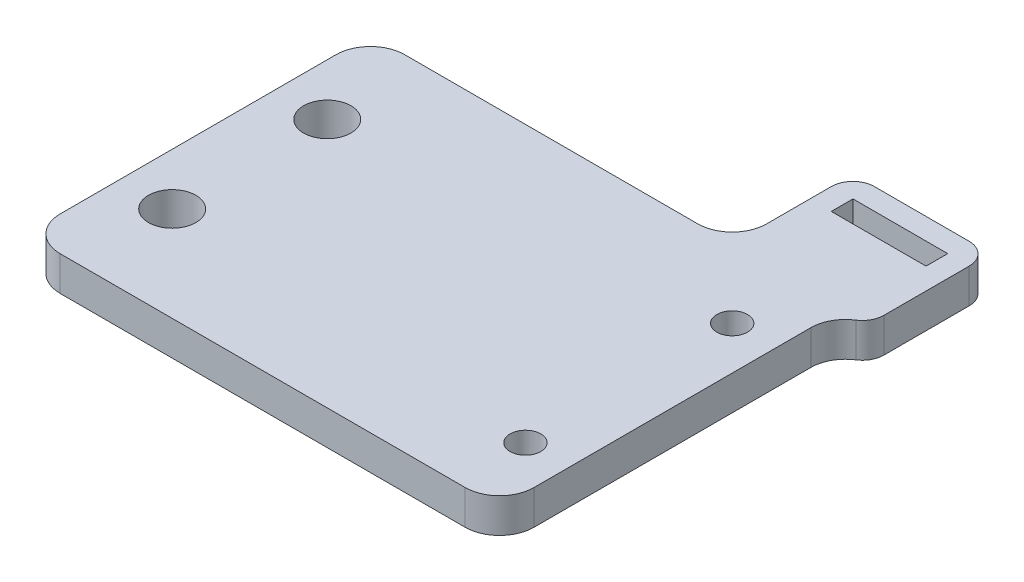
ISO-10303-21;
HEADER;
FILE_DESCRIPTION(('STEP AP214'),'2;1');
FILE_NAME('part.step','',(''),(''),'','','');
FILE_SCHEMA(('AUTOMOTIVE_DESIGN { 1 0 10303 214 1 1 1 1 }'));
ENDSEC;
DATA;
#1=APPLICATION_CONTEXT('core data for automotive mechanical design processes');
#2=APPLICATION_PROTOCOL_DEFINITION('international standard','automotive_design',2000,#1);
#3=PRODUCT_CONTEXT('',#1,'mechanical');
#4=PRODUCT('Part','Part','',(#3));
#5=PRODUCT_RELATED_PRODUCT_CATEGORY('part','',(#4));
#6=PRODUCT_DEFINITION_FORMATION('','',#4);
#7=PRODUCT_DEFINITION_CONTEXT('part definition',#1,'design');
#8=PRODUCT_DEFINITION('design','',#6,#7);
#9=PRODUCT_DEFINITION_SHAPE('','',#8);
#10=(LENGTH_UNIT() NAMED_UNIT(*) SI_UNIT(.MILLI.,.METRE.));
#11=(NAMED_UNIT(*) PLANE_ANGLE_UNIT() SI_UNIT($,.RADIAN.));
#12=(NAMED_UNIT(*) SI_UNIT($,.STERADIAN.) SOLID_ANGLE_UNIT());
#13=UNCERTAINTY_MEASURE_WITH_UNIT(LENGTH_MEASURE(1.E-05),#10,'distance_accuracy_value','');
#14=(GEOMETRIC_REPRESENTATION_CONTEXT(3) GLOBAL_UNCERTAINTY_ASSIGNED_CONTEXT((#13)) GLOBAL_UNIT_ASSIGNED_CONTEXT((#10,
#11,#12)) REPRESENTATION_CONTEXT('',''));
#15=CARTESIAN_POINT('',(0.,0.,0.));
#16=DIRECTION('',(0.,0.,1.));
#17=DIRECTION('',(1.,0.,0.));
#18=AXIS2_PLACEMENT_3D('',#15,#16,#17);
#19=CARTESIAN_POINT('',(0.,2.54,-25.4));
#20=DIRECTION('',(0.,0.,1.));
#21=DIRECTION('',(1.,0.,0.));
#22=AXIS2_PLACEMENT_3D('',#19,#20,#21);
#23=PLANE('',#22);
#24=DIRECTION('',(-1.,0.,0.));
#25=VECTOR('',#24,1.);
#26=CARTESIAN_POINT('',(0.,0.,-25.4));
#27=LINE('',#26,#25);
#28=CARTESIAN_POINT('',(24.13,0.,-25.4));
#29=VERTEX_POINT('',#28);
#30=CARTESIAN_POINT('',(2.54,0.,-25.4));
#31=VERTEX_POINT('',#30);
#32=EDGE_CURVE('E254',#29,#31,#27,.T.);
#33=ORIENTED_EDGE('',*,*,#32,.T.);
#34=DIRECTION('',(0.,-1.,0.));
#35=VECTOR('',#34,1.);
#36=CARTESIAN_POINT('',(2.54,2.54,-25.4));
#37=LINE('',#36,#35);
#38=CARTESIAN_POINT('',(2.54,2.54,-25.4));
#39=VERTEX_POINT('',#38);
#40=EDGE_CURVE('E41',#31,#39,#37,.F.);
#41=ORIENTED_EDGE('',*,*,#40,.T.);
#42=DIRECTION('',(-1.,0.,0.));
#43=VECTOR('',#42,1.);
#44=CARTESIAN_POINT('',(0.,2.54,-25.4));
#45=LINE('',#44,#43);
#46=CARTESIAN_POINT('',(24.13,2.54,-25.4));
#47=VERTEX_POINT('',#46);
#48=EDGE_CURVE('E258',#47,#39,#45,.T.);
#49=ORIENTED_EDGE('',*,*,#48,.F.);
#50=DIRECTION('',(0.,1.,0.));
#51=VECTOR('',#50,1.);
#52=CARTESIAN_POINT('',(24.13,2.54,-25.4));
#53=LINE('',#52,#51);
#54=EDGE_CURVE('E274',#47,#29,#53,.F.);
#55=ORIENTED_EDGE('',*,*,#54,.T.);
#56=EDGE_LOOP('',(#33,#41,#49,#55));
#57=FACE_BOUND('',#56,.T.);
#58=ADVANCED_FACE('F33',(#57),#23,.F.);
#59=CARTESIAN_POINT('',(0.,2.54,0.));
#60=DIRECTION('',(1.,0.,0.));
#61=DIRECTION('',(0.,0.,-1.));
#62=AXIS2_PLACEMENT_3D('',#59,#60,#61);
#63=PLANE('',#62);
#64=DIRECTION('',(0.,0.,1.));
#65=VECTOR('',#64,1.);
#66=CARTESIAN_POINT('',(0.,0.,0.));
#67=LINE('',#66,#65);
#68=CARTESIAN_POINT('',(0.,0.,-22.86));
#69=VERTEX_POINT('',#68);
#70=CARTESIAN_POINT('',(0.,0.,-2.54));
#71=VERTEX_POINT('',#70);
#72=EDGE_CURVE('E249',#69,#71,#67,.T.);
#73=ORIENTED_EDGE('',*,*,#72,.T.);
#74=DIRECTION('',(0.,-1.,0.));
#75=VECTOR('',#74,1.);
#76=CARTESIAN_POINT('',(0.,2.54,-2.54));
#77=LINE('',#76,#75);
#78=CARTESIAN_POINT('',(0.,2.54,-2.54));
#79=VERTEX_POINT('',#78);
#80=EDGE_CURVE('E328',#71,#79,#77,.F.);
#81=ORIENTED_EDGE('',*,*,#80,.T.);
#82=DIRECTION('',(0.,0.,1.));
#83=VECTOR('',#82,1.);
#84=CARTESIAN_POINT('',(0.,2.54,0.));
#85=LINE('',#84,#83);
#86=CARTESIAN_POINT('',(0.,2.54,-22.86));
#87=VERTEX_POINT('',#86);
#88=EDGE_CURVE('E250',#87,#79,#85,.T.);
#89=ORIENTED_EDGE('',*,*,#88,.F.);
#90=DIRECTION('',(0.,-1.,0.));
#91=VECTOR('',#90,1.);
#92=CARTESIAN_POINT('',(0.,2.54,-22.86));
#93=LINE('',#92,#91);
#94=EDGE_CURVE('E325',#87,#69,#93,.T.);
#95=ORIENTED_EDGE('',*,*,#94,.T.);
#96=EDGE_LOOP('',(#73,#81,#89,#95));
#97=FACE_BOUND('',#96,.T.);
#98=ADVANCED_FACE('F349',(#97),#63,.F.);
#99=CARTESIAN_POINT('',(0.,2.54,0.));
#100=DIRECTION('',(0.,0.,-1.));
#101=DIRECTION('',(-1.,0.,0.));
#102=AXIS2_PLACEMENT_3D('',#99,#100,#101);
#103=PLANE('',#102);
#104=DIRECTION('',(1.,0.,0.));
#105=VECTOR('',#104,1.);
#106=CARTESIAN_POINT('',(0.,2.54,0.));
#107=LINE('',#106,#105);
#108=CARTESIAN_POINT('',(2.54,2.54,0.));
#109=VERTEX_POINT('',#108);
#110=CARTESIAN_POINT('',(32.385,2.54,0.));
#111=VERTEX_POINT('',#110);
#112=EDGE_CURVE('E253',#109,#111,#107,.T.);
#113=ORIENTED_EDGE('',*,*,#112,.F.);
#114=DIRECTION('',(0.,-1.,0.));
#115=VECTOR('',#114,1.);
#116=CARTESIAN_POINT('',(2.54,2.54,0.));
#117=LINE('',#116,#115);
#118=CARTESIAN_POINT('',(2.54,0.,0.));
#119=VERTEX_POINT('',#118);
#120=EDGE_CURVE('E316',#109,#119,#117,.T.);
#121=ORIENTED_EDGE('',*,*,#120,.T.);
#122=DIRECTION('',(1.,0.,0.));
#123=VECTOR('',#122,1.);
#124=CARTESIAN_POINT('',(0.,0.,0.));
#125=LINE('',#124,#123);
#126=CARTESIAN_POINT('',(32.385,0.,0.));
#127=VERTEX_POINT('',#126);
#128=EDGE_CURVE('E263',#119,#127,#125,.T.);
#129=ORIENTED_EDGE('',*,*,#128,.T.);
#130=DIRECTION('',(0.,-1.,0.));
#131=VECTOR('',#130,1.);
#132=CARTESIAN_POINT('',(32.385,2.54,0.));
#133=LINE('',#132,#131);
#134=EDGE_CURVE('E314',#127,#111,#133,.F.);
#135=ORIENTED_EDGE('',*,*,#134,.T.);
#136=EDGE_LOOP('',(#113,#121,#129,#135));
#137=FACE_BOUND('',#136,.T.);
#138=ADVANCED_FACE('F342',(#137),#103,.F.);
#139=CARTESIAN_POINT('',(34.925,2.54,0.));
#140=DIRECTION('',(-1.,0.,0.));
#141=DIRECTION('',(0.,0.,1.));
#142=AXIS2_PLACEMENT_3D('',#139,#140,#141);
#143=PLANE('',#142);
#144=DIRECTION('',(0.,0.,-1.));
#145=VECTOR('',#144,1.);
#146=CARTESIAN_POINT('',(34.925,2.54,0.));
#147=LINE('',#146,#145);
#148=CARTESIAN_POINT('',(34.925,2.54,-2.54));
#149=VERTEX_POINT('',#148);
#150=CARTESIAN_POINT('',(34.925,2.54,-22.9406555751583));
#151=VERTEX_POINT('',#150);
#152=EDGE_CURVE('E256',#149,#151,#147,.T.);
#153=ORIENTED_EDGE('',*,*,#152,.F.);
#154=DIRECTION('',(0.,-1.,0.));
#155=VECTOR('',#154,1.);
#156=CARTESIAN_POINT('',(34.925,2.54,-2.54));
#157=LINE('',#156,#155);
#158=CARTESIAN_POINT('',(34.925,0.,-2.54));
#159=VERTEX_POINT('',#158);
#160=EDGE_CURVE('E11',#149,#159,#157,.T.);
#161=ORIENTED_EDGE('',*,*,#160,.T.);
#162=DIRECTION('',(0.,0.,-1.));
#163=VECTOR('',#162,1.);
#164=CARTESIAN_POINT('',(34.925,0.,0.));
#165=LINE('',#164,#163);
#166=CARTESIAN_POINT('',(34.925,0.,-22.9406555751583));
#167=VERTEX_POINT('',#166);
#168=EDGE_CURVE('E266',#159,#167,#165,.T.);
#169=ORIENTED_EDGE('',*,*,#168,.T.);
#170=DIRECTION('',(0.,1.,0.));
#171=VECTOR('',#170,1.);
#172=CARTESIAN_POINT('',(34.925,2.54,-22.9406555751583));
#173=LINE('',#172,#171);
#174=EDGE_CURVE('E260',#167,#151,#173,.T.);
#175=ORIENTED_EDGE('',*,*,#174,.T.);
#176=EDGE_LOOP('',(#153,#161,#169,#175));
#177=FACE_BOUND('',#176,.T.);
#178=ADVANCED_FACE('F394',(#177),#143,.F.);
#179=CARTESIAN_POINT('',(0.,2.54,0.));
#180=DIRECTION('',(0.,-1.,0.));
#181=DIRECTION('',(0.,0.,-1.));
#182=AXIS2_PLACEMENT_3D('',#179,#180,#181);
#183=PLANE('',#182);
#184=DIRECTION('',(-1.,0.,0.));
#185=VECTOR('',#184,1.);
#186=CARTESIAN_POINT('',(28.2575,2.54,-32.7137209347045));
#187=LINE('',#186,#185);
#188=CARTESIAN_POINT('',(35.2425,2.54,-32.7137209347045));
#189=VERTEX_POINT('',#188);
#190=CARTESIAN_POINT('',(28.2575,2.54,-32.7137209347045));
#191=VERTEX_POINT('',#190);
#192=EDGE_CURVE('E200',#189,#191,#187,.T.);
#193=ORIENTED_EDGE('',*,*,#192,.F.);
#194=DIRECTION('',(0.,0.,-1.));
#195=VECTOR('',#194,1.);
#196=CARTESIAN_POINT('',(35.2425,2.54,-32.7137209347045));
#197=LINE('',#196,#195);
#198=CARTESIAN_POINT('',(35.2425,2.54,-31.1135209347045));
#199=VERTEX_POINT('',#198);
#200=EDGE_CURVE('E173',#199,#189,#197,.T.);
#201=ORIENTED_EDGE('',*,*,#200,.F.);
#202=DIRECTION('',(1.,0.,0.));
#203=VECTOR('',#202,1.);
#204=CARTESIAN_POINT('',(28.2575,2.54,-31.1135209347045));
#205=LINE('',#204,#203);
#206=CARTESIAN_POINT('',(28.2575,2.54,-31.1135209347045));
#207=VERTEX_POINT('',#206);
#208=EDGE_CURVE('E191',#207,#199,#205,.T.);
#209=ORIENTED_EDGE('',*,*,#208,.F.);
#210=DIRECTION('',(0.,0.,1.));
#211=VECTOR('',#210,1.);
#212=CARTESIAN_POINT('',(28.2575,2.54,-32.7137209347045));
#213=LINE('',#212,#211);
#214=EDGE_CURVE('E194',#191,#207,#213,.T.);
#215=ORIENTED_EDGE('',*,*,#214,.F.);
#216=EDGE_LOOP('',(#193,#201,#209,#215));
#217=FACE_BOUND('',#216,.T.);
#218=CARTESIAN_POINT('',(31.75,2.54,-20.32));
#219=DIRECTION('',(0.,1.,0.));
#220=DIRECTION('',(0.,0.,1.));
#221=AXIS2_PLACEMENT_3D('',#218,#219,#220);
#222=CIRCLE('',#221,1.1303);
#223=CARTESIAN_POINT('',(31.75,2.54,-19.1897));
#224=VERTEX_POINT('',#223);
#225=EDGE_CURVE('E230',#224,#224,#222,.T.);
#226=ORIENTED_EDGE('',*,*,#225,.F.);
#227=EDGE_LOOP('',(#226));
#228=FACE_BOUND('',#227,.T.);
#229=CARTESIAN_POINT('',(31.75,2.54,-5.08));
#230=DIRECTION('',(0.,1.,0.));
#231=DIRECTION('',(0.,0.,-1.));
#232=AXIS2_PLACEMENT_3D('',#229,#230,#231);
#233=CIRCLE('',#232,1.1303);
#234=CARTESIAN_POINT('',(31.75,2.54,-6.2103));
#235=VERTEX_POINT('',#234);
#236=EDGE_CURVE('E219',#235,#235,#233,.T.);
#237=ORIENTED_EDGE('',*,*,#236,.F.);
#238=EDGE_LOOP('',(#237));
#239=FACE_BOUND('',#238,.T.);
#240=CARTESIAN_POINT('',(3.81,2.54,-18.415));
#241=DIRECTION('',(0.,-1.,0.));
#242=DIRECTION('',(0.,0.,-1.));
#243=AXIS2_PLACEMENT_3D('',#240,#241,#242);
#244=CIRCLE('',#243,1.74625);
#245=CARTESIAN_POINT('',(3.81,2.54,-20.16125));
#246=VERTEX_POINT('',#245);
#247=EDGE_CURVE('E246',#246,#246,#244,.F.);
#248=ORIENTED_EDGE('',*,*,#247,.F.);
#249=EDGE_LOOP('',(#248));
#250=FACE_BOUND('',#249,.T.);
#251=CARTESIAN_POINT('',(3.81,2.54,-6.985));
#252=DIRECTION('',(0.,-1.,0.));
#253=DIRECTION('',(0.,0.,-1.));
#254=AXIS2_PLACEMENT_3D('',#251,#252,#253);
#255=CIRCLE('',#254,1.74625);
#256=CARTESIAN_POINT('',(3.81,2.54,-8.73125));
#257=VERTEX_POINT('',#256);
#258=EDGE_CURVE('E241',#257,#257,#255,.F.);
#259=ORIENTED_EDGE('',*,*,#258,.F.);
#260=EDGE_LOOP('',(#259));
#261=FACE_BOUND('',#260,.T.);
#262=ORIENTED_EDGE('',*,*,#88,.T.);
#263=CARTESIAN_POINT('',(2.54,2.54,-2.54));
#264=DIRECTION('',(0.,-1.,0.));
#265=DIRECTION('',(0.,0.,-1.));
#266=AXIS2_PLACEMENT_3D('',#263,#264,#265);
#267=CIRCLE('',#266,2.54);
#268=EDGE_CURVE('E333',#79,#109,#267,.F.);
#269=ORIENTED_EDGE('',*,*,#268,.T.);
#270=ORIENTED_EDGE('',*,*,#112,.T.);
#271=CARTESIAN_POINT('',(32.385,2.54,-2.54));
#272=DIRECTION('',(0.,-1.,0.));
#273=DIRECTION('',(0.,0.,-1.));
#274=AXIS2_PLACEMENT_3D('',#271,#272,#273);
#275=CIRCLE('',#274,2.54);
#276=EDGE_CURVE('E48',#111,#149,#275,.F.);
#277=ORIENTED_EDGE('',*,*,#276,.T.);
#278=ORIENTED_EDGE('',*,*,#152,.T.);
#279=CARTESIAN_POINT('',(37.465,2.54,-22.9406555751583));
#280=DIRECTION('',(0.,-1.,0.));
#281=DIRECTION('',(0.,0.,-1.));
#282=AXIS2_PLACEMENT_3D('',#279,#280,#281);
#283=CIRCLE('',#282,2.54);
#284=CARTESIAN_POINT('',(36.0973076923077,2.54,-25.0809867998708));
#285=VERTEX_POINT('',#284);
#286=EDGE_CURVE('E279',#151,#285,#283,.T.);
#287=ORIENTED_EDGE('',*,*,#286,.T.);
#288=CARTESIAN_POINT('',(35.2425,2.54,-26.4186938153161));
#289=DIRECTION('',(0.,-1.,0.));
#290=DIRECTION('',(0.,0.,-1.));
#291=AXIS2_PLACEMENT_3D('',#288,#289,#290);
#292=CIRCLE('',#291,1.5875);
#293=CARTESIAN_POINT('',(36.83,2.54,-26.4186938153161));
#294=VERTEX_POINT('',#293);
#295=EDGE_CURVE('E292',#285,#294,#292,.F.);
#296=ORIENTED_EDGE('',*,*,#295,.T.);
#297=DIRECTION('',(0.,0.,-1.));
#298=VECTOR('',#297,1.);
#299=CARTESIAN_POINT('',(36.83,2.54,-34.29));
#300=LINE('',#299,#298);
#301=CARTESIAN_POINT('',(36.83,2.54,-32.7025));
#302=VERTEX_POINT('',#301);
#303=EDGE_CURVE('E221',#294,#302,#300,.T.);
#304=ORIENTED_EDGE('',*,*,#303,.T.);
#305=CARTESIAN_POINT('',(35.2425,2.54,-32.7025));
#306=DIRECTION('',(0.,-1.,0.));
#307=DIRECTION('',(0.,0.,-1.));
#308=AXIS2_PLACEMENT_3D('',#305,#306,#307);
#309=CIRCLE('',#308,1.5875);
#310=CARTESIAN_POINT('',(35.2425,2.54,-34.29));
#311=VERTEX_POINT('',#310);
#312=EDGE_CURVE('E296',#302,#311,#309,.F.);
#313=ORIENTED_EDGE('',*,*,#312,.T.);
#314=DIRECTION('',(-1.,0.,0.));
#315=VECTOR('',#314,1.);
#316=CARTESIAN_POINT('',(36.83,2.54,-34.29));
#317=LINE('',#316,#315);
#318=CARTESIAN_POINT('',(28.2575,2.54,-34.29));
#319=VERTEX_POINT('',#318);
#320=EDGE_CURVE('E213',#311,#319,#317,.T.);
#321=ORIENTED_EDGE('',*,*,#320,.T.);
#322=CARTESIAN_POINT('',(28.2575,2.54,-32.7025));
#323=DIRECTION('',(0.,-1.,0.));
#324=DIRECTION('',(0.,0.,-1.));
#325=AXIS2_PLACEMENT_3D('',#322,#323,#324);
#326=CIRCLE('',#325,1.5875);
#327=CARTESIAN_POINT('',(26.67,2.54,-32.7025));
#328=VERTEX_POINT('',#327);
#329=EDGE_CURVE('E294',#319,#328,#326,.F.);
#330=ORIENTED_EDGE('',*,*,#329,.T.);
#331=DIRECTION('',(0.,0.,1.));
#332=VECTOR('',#331,1.);
#333=CARTESIAN_POINT('',(26.67,2.54,-34.29));
#334=LINE('',#333,#332);
#335=CARTESIAN_POINT('',(26.67,2.54,-27.94));
#336=VERTEX_POINT('',#335);
#337=EDGE_CURVE('E206',#328,#336,#334,.T.);
#338=ORIENTED_EDGE('',*,*,#337,.T.);
#339=CARTESIAN_POINT('',(24.13,2.54,-27.94));
#340=DIRECTION('',(0.,-1.,0.));
#341=DIRECTION('',(0.,0.,-1.));
#342=AXIS2_PLACEMENT_3D('',#339,#340,#341);
#343=CIRCLE('',#342,2.54);
#344=EDGE_CURVE('E282',#336,#47,#343,.T.);
#345=ORIENTED_EDGE('',*,*,#344,.T.);
#346=ORIENTED_EDGE('',*,*,#48,.T.);
#347=CARTESIAN_POINT('',(2.54,2.54,-22.86));
#348=DIRECTION('',(0.,-1.,0.));
#349=DIRECTION('',(0.,0.,-1.));
#350=AXIS2_PLACEMENT_3D('',#347,#348,#349);
#351=CIRCLE('',#350,2.54);
#352=EDGE_CURVE('E331',#39,#87,#351,.F.);
#353=ORIENTED_EDGE('',*,*,#352,.T.);
#354=EDGE_LOOP('',(#262,#269,#270,#277,#278,#287,#296,#304,#313,#321,#330,#338,#345,#346,#353));
#355=FACE_BOUND('',#354,.T.);
#356=ADVANCED_FACE('F336',(#217,#228,#239,#250,#261,#355),#183,.F.);
#357=CARTESIAN_POINT('',(0.,0.,0.));
#358=DIRECTION('',(0.,-1.,0.));
#359=DIRECTION('',(0.,0.,-1.));
#360=AXIS2_PLACEMENT_3D('',#357,#358,#359);
#361=PLANE('',#360);
#362=DIRECTION('',(0.,0.,-1.));
#363=VECTOR('',#362,1.);
#364=CARTESIAN_POINT('',(35.2425,0.,-32.7137209347045));
#365=LINE('',#364,#363);
#366=CARTESIAN_POINT('',(35.2425,0.,-31.1135209347045));
#367=VERTEX_POINT('',#366);
#368=CARTESIAN_POINT('',(35.2425,0.,-32.7137209347045));
#369=VERTEX_POINT('',#368);
#370=EDGE_CURVE('E170',#367,#369,#365,.T.);
#371=ORIENTED_EDGE('',*,*,#370,.T.);
#372=DIRECTION('',(-1.,0.,0.));
#373=VECTOR('',#372,1.);
#374=CARTESIAN_POINT('',(28.2575,0.,-32.7137209347045));
#375=LINE('',#374,#373);
#376=CARTESIAN_POINT('',(28.2575,0.,-32.7137209347045));
#377=VERTEX_POINT('',#376);
#378=EDGE_CURVE('E182',#369,#377,#375,.T.);
#379=ORIENTED_EDGE('',*,*,#378,.T.);
#380=DIRECTION('',(0.,0.,1.));
#381=VECTOR('',#380,1.);
#382=CARTESIAN_POINT('',(28.2575,0.,-32.7137209347045));
#383=LINE('',#382,#381);
#384=CARTESIAN_POINT('',(28.2575,0.,-31.1135209347045));
#385=VERTEX_POINT('',#384);
#386=EDGE_CURVE('E186',#377,#385,#383,.T.);
#387=ORIENTED_EDGE('',*,*,#386,.T.);
#388=DIRECTION('',(1.,0.,0.));
#389=VECTOR('',#388,1.);
#390=CARTESIAN_POINT('',(28.2575,0.,-31.1135209347045));
#391=LINE('',#390,#389);
#392=EDGE_CURVE('E178',#385,#367,#391,.T.);
#393=ORIENTED_EDGE('',*,*,#392,.T.);
#394=EDGE_LOOP('',(#371,#379,#387,#393));
#395=FACE_BOUND('',#394,.T.);
#396=CARTESIAN_POINT('',(31.75,0.,-20.32));
#397=DIRECTION('',(0.,1.,0.));
#398=DIRECTION('',(0.,0.,1.));
#399=AXIS2_PLACEMENT_3D('',#396,#397,#398);
#400=CIRCLE('',#399,1.1303);
#401=CARTESIAN_POINT('',(31.75,0.,-19.1897));
#402=VERTEX_POINT('',#401);
#403=EDGE_CURVE('E226',#402,#402,#400,.T.);
#404=ORIENTED_EDGE('',*,*,#403,.T.);
#405=EDGE_LOOP('',(#404));
#406=FACE_BOUND('',#405,.T.);
#407=CARTESIAN_POINT('',(31.75,0.,-5.08));
#408=DIRECTION('',(0.,1.,0.));
#409=DIRECTION('',(0.,0.,-1.));
#410=AXIS2_PLACEMENT_3D('',#407,#408,#409);
#411=CIRCLE('',#410,1.1303);
#412=CARTESIAN_POINT('',(31.75,0.,-6.2103));
#413=VERTEX_POINT('',#412);
#414=EDGE_CURVE('E233',#413,#413,#411,.T.);
#415=ORIENTED_EDGE('',*,*,#414,.T.);
#416=EDGE_LOOP('',(#415));
#417=FACE_BOUND('',#416,.T.);
#418=CARTESIAN_POINT('',(3.81,0.,-18.415));
#419=DIRECTION('',(0.,1.,0.));
#420=DIRECTION('',(0.,0.,1.));
#421=AXIS2_PLACEMENT_3D('',#418,#419,#420);
#422=CIRCLE('',#421,1.74625);
#423=CARTESIAN_POINT('',(3.81,0.,-20.16125));
#424=VERTEX_POINT('',#423);
#425=EDGE_CURVE('E238',#424,#424,#422,.T.);
#426=ORIENTED_EDGE('',*,*,#425,.T.);
#427=EDGE_LOOP('',(#426));
#428=FACE_BOUND('',#427,.T.);
#429=CARTESIAN_POINT('',(3.81,0.,-6.985));
#430=DIRECTION('',(0.,1.,0.));
#431=DIRECTION('',(0.,0.,-1.));
#432=AXIS2_PLACEMENT_3D('',#429,#430,#431);
#433=CIRCLE('',#432,1.74625);
#434=CARTESIAN_POINT('',(3.81,0.,-8.73125));
#435=VERTEX_POINT('',#434);
#436=EDGE_CURVE('E229',#435,#435,#433,.T.);
#437=ORIENTED_EDGE('',*,*,#436,.T.);
#438=EDGE_LOOP('',(#437));
#439=FACE_BOUND('',#438,.T.);
#440=ORIENTED_EDGE('',*,*,#128,.F.);
#441=CARTESIAN_POINT('',(2.54,0.,-2.54));
#442=DIRECTION('',(0.,-1.,0.));
#443=DIRECTION('',(0.,0.,-1.));
#444=AXIS2_PLACEMENT_3D('',#441,#442,#443);
#445=CIRCLE('',#444,2.54);
#446=EDGE_CURVE('E323',#119,#71,#445,.T.);
#447=ORIENTED_EDGE('',*,*,#446,.T.);
#448=ORIENTED_EDGE('',*,*,#72,.F.);
#449=CARTESIAN_POINT('',(2.54,0.,-22.86));
#450=DIRECTION('',(0.,-1.,0.));
#451=DIRECTION('',(0.,0.,-1.));
#452=AXIS2_PLACEMENT_3D('',#449,#450,#451);
#453=CIRCLE('',#452,2.54);
#454=EDGE_CURVE('E321',#69,#31,#453,.T.);
#455=ORIENTED_EDGE('',*,*,#454,.T.);
#456=ORIENTED_EDGE('',*,*,#32,.F.);
#457=CARTESIAN_POINT('',(24.13,0.,-27.94));
#458=DIRECTION('',(0.,-1.,0.));
#459=DIRECTION('',(0.,0.,-1.));
#460=AXIS2_PLACEMENT_3D('',#457,#458,#459);
#461=CIRCLE('',#460,2.54);
#462=CARTESIAN_POINT('',(26.67,0.,-27.94));
#463=VERTEX_POINT('',#462);
#464=EDGE_CURVE('E284',#29,#463,#461,.F.);
#465=ORIENTED_EDGE('',*,*,#464,.T.);
#466=DIRECTION('',(0.,0.,1.));
#467=VECTOR('',#466,1.);
#468=CARTESIAN_POINT('',(26.67,0.,-34.29));
#469=LINE('',#468,#467);
#470=CARTESIAN_POINT('',(26.67,0.,-32.7025));
#471=VERTEX_POINT('',#470);
#472=EDGE_CURVE('E210',#471,#463,#469,.T.);
#473=ORIENTED_EDGE('',*,*,#472,.F.);
#474=CARTESIAN_POINT('',(28.2575,0.,-32.7025));
#475=DIRECTION('',(0.,-1.,0.));
#476=DIRECTION('',(0.,0.,-1.));
#477=AXIS2_PLACEMENT_3D('',#474,#475,#476);
#478=CIRCLE('',#477,1.5875);
#479=CARTESIAN_POINT('',(28.2575,0.,-34.29));
#480=VERTEX_POINT('',#479);
#481=EDGE_CURVE('E305',#471,#480,#478,.T.);
#482=ORIENTED_EDGE('',*,*,#481,.T.);
#483=DIRECTION('',(-1.,0.,0.));
#484=VECTOR('',#483,1.);
#485=CARTESIAN_POINT('',(36.83,0.,-34.29));
#486=LINE('',#485,#484);
#487=CARTESIAN_POINT('',(35.2425,0.,-34.29));
#488=VERTEX_POINT('',#487);
#489=EDGE_CURVE('E216',#488,#480,#486,.T.);
#490=ORIENTED_EDGE('',*,*,#489,.F.);
#491=CARTESIAN_POINT('',(35.2425,0.,-32.7025));
#492=DIRECTION('',(0.,-1.,0.));
#493=DIRECTION('',(0.,0.,-1.));
#494=AXIS2_PLACEMENT_3D('',#491,#492,#493);
#495=CIRCLE('',#494,1.5875);
#496=CARTESIAN_POINT('',(36.83,0.,-32.7025));
#497=VERTEX_POINT('',#496);
#498=EDGE_CURVE('E307',#488,#497,#495,.T.);
#499=ORIENTED_EDGE('',*,*,#498,.T.);
#500=DIRECTION('',(0.,0.,-1.));
#501=VECTOR('',#500,1.);
#502=CARTESIAN_POINT('',(36.83,0.,-34.29));
#503=LINE('',#502,#501);
#504=CARTESIAN_POINT('',(36.83,0.,-26.4186938153161));
#505=VERTEX_POINT('',#504);
#506=EDGE_CURVE('E212',#505,#497,#503,.T.);
#507=ORIENTED_EDGE('',*,*,#506,.F.);
#508=CARTESIAN_POINT('',(35.2425,0.,-26.4186938153161));
#509=DIRECTION('',(0.,-1.,0.));
#510=DIRECTION('',(0.,0.,-1.));
#511=AXIS2_PLACEMENT_3D('',#508,#509,#510);
#512=CIRCLE('',#511,1.5875);
#513=CARTESIAN_POINT('',(36.0973076923077,0.,-25.0809867998708));
#514=VERTEX_POINT('',#513);
#515=EDGE_CURVE('E303',#505,#514,#512,.T.);
#516=ORIENTED_EDGE('',*,*,#515,.T.);
#517=CARTESIAN_POINT('',(37.465,0.,-22.9406555751583));
#518=DIRECTION('',(0.,-1.,0.));
#519=DIRECTION('',(0.,0.,-1.));
#520=AXIS2_PLACEMENT_3D('',#517,#518,#519);
#521=CIRCLE('',#520,2.54);
#522=EDGE_CURVE('E276',#514,#167,#521,.F.);
#523=ORIENTED_EDGE('',*,*,#522,.T.);
#524=ORIENTED_EDGE('',*,*,#168,.F.);
#525=CARTESIAN_POINT('',(32.385,0.,-2.54));
#526=DIRECTION('',(0.,-1.,0.));
#527=DIRECTION('',(0.,0.,-1.));
#528=AXIS2_PLACEMENT_3D('',#525,#526,#527);
#529=CIRCLE('',#528,2.54);
#530=EDGE_CURVE('E319',#159,#127,#529,.T.);
#531=ORIENTED_EDGE('',*,*,#530,.T.);
#532=EDGE_LOOP('',(#440,#447,#448,#455,#456,#465,#473,#482,#490,#499,#507,#516,#523,#524,#531));
#533=FACE_BOUND('',#532,.T.);
#534=ADVANCED_FACE('F188',(#395,#406,#417,#428,#439,#533),#361,.T.);
#535=CARTESIAN_POINT('',(3.81,2.540012,-6.985));
#536=DIRECTION('',(0.,-1.,0.));
#537=DIRECTION('',(0.,0.,-1.));
#538=AXIS2_PLACEMENT_3D('',#535,#536,#537);
#539=CYLINDRICAL_SURFACE('',#538,1.74625);
#540=CARTESIAN_POINT('',(3.81,0.,-8.73125));
#541=CARTESIAN_POINT('',(3.81,0.0264583333333329,-8.73125));
#542=CARTESIAN_POINT('',(3.81,0.0529166666666662,-8.73125));
#543=CARTESIAN_POINT('',(3.81,0.105833333333333,-8.73125));
#544=CARTESIAN_POINT('',(3.81,0.132291666666666,-8.73125));
#545=CARTESIAN_POINT('',(3.81,0.185208333333333,-8.73125));
#546=CARTESIAN_POINT('',(3.81,0.211666666666666,-8.73125));
#547=CARTESIAN_POINT('',(3.81,0.264583333333333,-8.73125));
#548=CARTESIAN_POINT('',(3.81,0.291041666666666,-8.73125));
#549=CARTESIAN_POINT('',(3.81,0.343958333333333,-8.73125));
#550=CARTESIAN_POINT('',(3.81,0.370416666666666,-8.73125));
#551=CARTESIAN_POINT('',(3.81,0.423333333333333,-8.73125));
#552=CARTESIAN_POINT('',(3.81,0.449791666666666,-8.73125));
#553=CARTESIAN_POINT('',(3.81,0.502708333333333,-8.73125));
#554=CARTESIAN_POINT('',(3.81,0.529166666666666,-8.73125));
#555=CARTESIAN_POINT('',(3.81,0.582083333333333,-8.73125));
#556=CARTESIAN_POINT('',(3.81,0.608541666666666,-8.73125));
#557=CARTESIAN_POINT('',(3.81,0.661458333333333,-8.73125));
#558=CARTESIAN_POINT('',(3.81,0.687916666666666,-8.73125));
#559=CARTESIAN_POINT('',(3.81,0.740833333333333,-8.73125));
#560=CARTESIAN_POINT('',(3.81,0.767291666666666,-8.73125));
#561=CARTESIAN_POINT('',(3.81,0.820208333333333,-8.73125));
#562=CARTESIAN_POINT('',(3.81,0.846666666666666,-8.73125));
#563=CARTESIAN_POINT('',(3.81,0.899583333333333,-8.73125));
#564=CARTESIAN_POINT('',(3.81,0.926041666666666,-8.73125));
#565=CARTESIAN_POINT('',(3.81,0.978958333333333,-8.73125));
#566=CARTESIAN_POINT('',(3.81,1.00541666666667,-8.73125));
#567=CARTESIAN_POINT('',(3.81,1.05833333333333,-8.73125));
#568=CARTESIAN_POINT('',(3.81,1.08479166666667,-8.73125));
#569=CARTESIAN_POINT('',(3.81,1.13770833333333,-8.73125));
#570=CARTESIAN_POINT('',(3.81,1.16416666666667,-8.73125));
#571=CARTESIAN_POINT('',(3.81,1.21708333333333,-8.73125));
#572=CARTESIAN_POINT('',(3.81,1.24354166666667,-8.73125));
#573=CARTESIAN_POINT('',(3.81,1.29645833333333,-8.73125));
#574=CARTESIAN_POINT('',(3.81,1.32291666666667,-8.73125));
#575=CARTESIAN_POINT('',(3.81,1.37583333333333,-8.73125));
#576=CARTESIAN_POINT('',(3.81,1.40229166666667,-8.73125));
#577=CARTESIAN_POINT('',(3.81,1.45520833333333,-8.73125));
#578=CARTESIAN_POINT('',(3.81,1.48166666666667,-8.73125));
#579=CARTESIAN_POINT('',(3.81,1.53458333333333,-8.73125));
#580=CARTESIAN_POINT('',(3.81,1.56104166666667,-8.73125));
#581=CARTESIAN_POINT('',(3.81,1.61395833333333,-8.73125));
#582=CARTESIAN_POINT('',(3.81,1.64041666666667,-8.73125));
#583=CARTESIAN_POINT('',(3.81,1.69333333333333,-8.73125));
#584=CARTESIAN_POINT('',(3.81,1.71979166666667,-8.73125));
#585=CARTESIAN_POINT('',(3.81,1.77270833333333,-8.73125));
#586=CARTESIAN_POINT('',(3.81,1.79916666666667,-8.73125));
#587=CARTESIAN_POINT('',(3.81,1.85208333333333,-8.73125));
#588=CARTESIAN_POINT('',(3.81,1.87854166666667,-8.73125));
#589=CARTESIAN_POINT('',(3.81,1.93145833333333,-8.73125));
#590=CARTESIAN_POINT('',(3.81,1.95791666666667,-8.73125));
#591=CARTESIAN_POINT('',(3.81,2.01083333333333,-8.73125));
#592=CARTESIAN_POINT('',(3.81,2.03729166666667,-8.73125));
#593=CARTESIAN_POINT('',(3.81,2.09020833333333,-8.73125));
#594=CARTESIAN_POINT('',(3.81,2.11666666666667,-8.73125));
#595=CARTESIAN_POINT('',(3.81,2.16958333333333,-8.73125));
#596=CARTESIAN_POINT('',(3.81,2.19604166666667,-8.73125));
#597=CARTESIAN_POINT('',(3.81,2.24895833333333,-8.73125));
#598=CARTESIAN_POINT('',(3.81,2.27541666666667,-8.73125));
#599=CARTESIAN_POINT('',(3.81,2.32833333333333,-8.73125));
#600=CARTESIAN_POINT('',(3.81,2.35479166666667,-8.73125));
#601=CARTESIAN_POINT('',(3.81,2.40770833333333,-8.73125));
#602=CARTESIAN_POINT('',(3.81,2.43416666666667,-8.73125));
#603=CARTESIAN_POINT('',(3.81,2.48708333333333,-8.73125));
#604=CARTESIAN_POINT('',(3.81,2.51354166666667,-8.73125));
#605=CARTESIAN_POINT('',(3.81,2.54,-8.73125));
#606=B_SPLINE_CURVE_WITH_KNOTS('',3,(#540,#541,#542,#543,#544,#545,#546,#547,#548,#549,#550,
#551,#552,#553,#554,#555,#556,#557,#558,#559,#560,#561,#562,#563,#564,#565,#566,#567,#568,#569,
#570,#571,#572,#573,#574,#575,#576,#577,#578,#579,#580,#581,#582,#583,#584,#585,#586,#587,#588,
#589,#590,#591,#592,#593,#594,#595,#596,#597,#598,#599,#600,#601,#602,#603,#604,#605),
.UNSPECIFIED.,.F.,.F.,(4,2,2,2,2,2,2,2,2,2,2,2,2,2,2,2,2,2,2,2,2,2,2,2,2,2,2,2,2,2,2,2,4),(0.,
0.079375,0.15875,0.238125,0.3175,0.396875,0.47625,0.555625,0.635,0.714375,0.79375,0.873125,
0.9525,1.031875,1.11125,1.190625,1.27,1.349375,1.42875,1.508125,1.5875,1.666875,1.74625,
1.825625,1.905,1.984375,2.06375,2.143125,2.2225,2.301875,2.38125,2.460625,2.54),.UNSPECIFIED.);
#607=EDGE_CURVE('BSEAM530',#435,#257,#606,.T.);
#608=ORIENTED_EDGE('',*,*,#436,.F.);
#609=ORIENTED_EDGE('',*,*,#258,.T.);
#610=ORIENTED_EDGE('',*,*,#607,.T.);
#611=ORIENTED_EDGE('',*,*,#607,.F.);
#612=EDGE_LOOP('',(#608,#610,#609,#611));
#613=FACE_BOUND('',#612,.T.);
#614=ADVANCED_FACE('F530',(#613),#539,.F.);
#615=CARTESIAN_POINT('',(3.81,2.540012,-18.415));
#616=DIRECTION('',(0.,-1.,0.));
#617=DIRECTION('',(0.,0.,-1.));
#618=AXIS2_PLACEMENT_3D('',#615,#616,#617);
#619=CYLINDRICAL_SURFACE('',#618,1.74625);
#620=CARTESIAN_POINT('',(3.81,0.,-20.16125));
#621=CARTESIAN_POINT('',(3.81,0.0264583333333329,-20.16125));
#622=CARTESIAN_POINT('',(3.81,0.0529166666666662,-20.16125));
#623=CARTESIAN_POINT('',(3.81,0.105833333333333,-20.16125));
#624=CARTESIAN_POINT('',(3.81,0.132291666666666,-20.16125));
#625=CARTESIAN_POINT('',(3.81,0.185208333333333,-20.16125));
#626=CARTESIAN_POINT('',(3.81,0.211666666666666,-20.16125));
#627=CARTESIAN_POINT('',(3.81,0.264583333333333,-20.16125));
#628=CARTESIAN_POINT('',(3.81,0.291041666666666,-20.16125));
#629=CARTESIAN_POINT('',(3.81,0.343958333333333,-20.16125));
#630=CARTESIAN_POINT('',(3.81,0.370416666666666,-20.16125));
#631=CARTESIAN_POINT('',(3.81,0.423333333333333,-20.16125));
#632=CARTESIAN_POINT('',(3.81,0.449791666666666,-20.16125));
#633=CARTESIAN_POINT('',(3.81,0.502708333333333,-20.16125));
#634=CARTESIAN_POINT('',(3.81,0.529166666666666,-20.16125));
#635=CARTESIAN_POINT('',(3.81,0.582083333333333,-20.16125));
#636=CARTESIAN_POINT('',(3.81,0.608541666666666,-20.16125));
#637=CARTESIAN_POINT('',(3.81,0.661458333333333,-20.16125));
#638=CARTESIAN_POINT('',(3.81,0.687916666666666,-20.16125));
#639=CARTESIAN_POINT('',(3.81,0.740833333333333,-20.16125));
#640=CARTESIAN_POINT('',(3.81,0.767291666666666,-20.16125));
#641=CARTESIAN_POINT('',(3.81,0.820208333333333,-20.16125));
#642=CARTESIAN_POINT('',(3.81,0.846666666666666,-20.16125));
#643=CARTESIAN_POINT('',(3.81,0.899583333333333,-20.16125));
#644=CARTESIAN_POINT('',(3.81,0.926041666666666,-20.16125));
#645=CARTESIAN_POINT('',(3.81,0.978958333333333,-20.16125));
#646=CARTESIAN_POINT('',(3.81,1.00541666666667,-20.16125));
#647=CARTESIAN_POINT('',(3.81,1.05833333333333,-20.16125));
#648=CARTESIAN_POINT('',(3.81,1.08479166666667,-20.16125));
#649=CARTESIAN_POINT('',(3.81,1.13770833333333,-20.16125));
#650=CARTESIAN_POINT('',(3.81,1.16416666666667,-20.16125));
#651=CARTESIAN_POINT('',(3.81,1.21708333333333,-20.16125));
#652=CARTESIAN_POINT('',(3.81,1.24354166666667,-20.16125));
#653=CARTESIAN_POINT('',(3.81,1.29645833333333,-20.16125));
#654=CARTESIAN_POINT('',(3.81,1.32291666666667,-20.16125));
#655=CARTESIAN_POINT('',(3.81,1.37583333333333,-20.16125));
#656=CARTESIAN_POINT('',(3.81,1.40229166666667,-20.16125));
#657=CARTESIAN_POINT('',(3.81,1.45520833333333,-20.16125));
#658=CARTESIAN_POINT('',(3.81,1.48166666666667,-20.16125));
#659=CARTESIAN_POINT('',(3.81,1.53458333333333,-20.16125));
#660=CARTESIAN_POINT('',(3.81,1.56104166666667,-20.16125));
#661=CARTESIAN_POINT('',(3.81,1.61395833333333,-20.16125));
#662=CARTESIAN_POINT('',(3.81,1.64041666666667,-20.16125));
#663=CARTESIAN_POINT('',(3.81,1.69333333333333,-20.16125));
#664=CARTESIAN_POINT('',(3.81,1.71979166666667,-20.16125));
#665=CARTESIAN_POINT('',(3.81,1.77270833333333,-20.16125));
#666=CARTESIAN_POINT('',(3.81,1.79916666666667,-20.16125));
#667=CARTESIAN_POINT('',(3.81,1.85208333333333,-20.16125));
#668=CARTESIAN_POINT('',(3.81,1.87854166666667,-20.16125));
#669=CARTESIAN_POINT('',(3.81,1.93145833333333,-20.16125));
#670=CARTESIAN_POINT('',(3.81,1.95791666666667,-20.16125));
#671=CARTESIAN_POINT('',(3.81,2.01083333333333,-20.16125));
#672=CARTESIAN_POINT('',(3.81,2.03729166666667,-20.16125));
#673=CARTESIAN_POINT('',(3.81,2.09020833333333,-20.16125));
#674=CARTESIAN_POINT('',(3.81,2.11666666666667,-20.16125));
#675=CARTESIAN_POINT('',(3.81,2.16958333333333,-20.16125));
#676=CARTESIAN_POINT('',(3.81,2.19604166666667,-20.16125));
#677=CARTESIAN_POINT('',(3.81,2.24895833333333,-20.16125));
#678=CARTESIAN_POINT('',(3.81,2.27541666666667,-20.16125));
#679=CARTESIAN_POINT('',(3.81,2.32833333333333,-20.16125));
#680=CARTESIAN_POINT('',(3.81,2.35479166666667,-20.16125));
#681=CARTESIAN_POINT('',(3.81,2.40770833333333,-20.16125));
#682=CARTESIAN_POINT('',(3.81,2.43416666666667,-20.16125));
#683=CARTESIAN_POINT('',(3.81,2.48708333333333,-20.16125));
#684=CARTESIAN_POINT('',(3.81,2.51354166666667,-20.16125));
#685=CARTESIAN_POINT('',(3.81,2.54,-20.16125));
#686=B_SPLINE_CURVE_WITH_KNOTS('',3,(#620,#621,#622,#623,#624,#625,#626,#627,#628,#629,#630,
#631,#632,#633,#634,#635,#636,#637,#638,#639,#640,#641,#642,#643,#644,#645,#646,#647,#648,#649,
#650,#651,#652,#653,#654,#655,#656,#657,#658,#659,#660,#661,#662,#663,#664,#665,#666,#667,#668,
#669,#670,#671,#672,#673,#674,#675,#676,#677,#678,#679,#680,#681,#682,#683,#684,#685),
.UNSPECIFIED.,.F.,.F.,(4,2,2,2,2,2,2,2,2,2,2,2,2,2,2,2,2,2,2,2,2,2,2,2,2,2,2,2,2,2,2,2,4),(0.,
0.079375,0.15875,0.238125,0.3175,0.396875,0.47625,0.555625,0.635,0.714375,0.79375,0.873125,
0.9525,1.031875,1.11125,1.190625,1.27,1.349375,1.42875,1.508125,1.5875,1.666875,1.74625,
1.825625,1.905,1.984375,2.06375,2.143125,2.2225,2.301875,2.38125,2.460625,2.54),.UNSPECIFIED.);
#687=EDGE_CURVE('BSEAM565',#424,#246,#686,.T.);
#688=ORIENTED_EDGE('',*,*,#425,.F.);
#689=ORIENTED_EDGE('',*,*,#247,.T.);
#690=ORIENTED_EDGE('',*,*,#687,.T.);
#691=ORIENTED_EDGE('',*,*,#687,.F.);
#692=EDGE_LOOP('',(#688,#690,#689,#691));
#693=FACE_BOUND('',#692,.T.);
#694=ADVANCED_FACE('F565',(#693),#619,.F.);
#695=CARTESIAN_POINT('',(31.75,0.,-5.08));
#696=DIRECTION('',(0.,1.,0.));
#697=DIRECTION('',(0.,0.,1.));
#698=AXIS2_PLACEMENT_3D('',#695,#696,#697);
#699=CYLINDRICAL_SURFACE('',#698,1.1303);
#700=ORIENTED_EDGE('',*,*,#414,.F.);
#701=EDGE_LOOP('',(#700));
#702=FACE_BOUND('',#701,.T.);
#703=ORIENTED_EDGE('',*,*,#236,.T.);
#704=EDGE_LOOP('',(#703));
#705=FACE_BOUND('',#704,.T.);
#706=ADVANCED_FACE('F556',(#702,#705),#699,.F.);
#707=CARTESIAN_POINT('',(31.75,0.,-20.32));
#708=DIRECTION('',(0.,1.,0.));
#709=DIRECTION('',(0.,0.,1.));
#710=AXIS2_PLACEMENT_3D('',#707,#708,#709);
#711=CYLINDRICAL_SURFACE('',#710,1.1303);
#712=ORIENTED_EDGE('',*,*,#403,.F.);
#713=EDGE_LOOP('',(#712));
#714=FACE_BOUND('',#713,.T.);
#715=ORIENTED_EDGE('',*,*,#225,.T.);
#716=EDGE_LOOP('',(#715));
#717=FACE_BOUND('',#716,.T.);
#718=ADVANCED_FACE('F522',(#714,#717),#711,.F.);
#719=CARTESIAN_POINT('',(26.67,0.,-34.29));
#720=DIRECTION('',(-1.,0.,0.));
#721=DIRECTION('',(0.,0.,1.));
#722=AXIS2_PLACEMENT_3D('',#719,#720,#721);
#723=PLANE('',#722);
#724=ORIENTED_EDGE('',*,*,#337,.F.);
#725=DIRECTION('',(0.,1.,0.));
#726=VECTOR('',#725,1.);
#727=CARTESIAN_POINT('',(26.67,0.,-32.7025));
#728=LINE('',#727,#726);
#729=EDGE_CURVE('E309',#328,#471,#728,.F.);
#730=ORIENTED_EDGE('',*,*,#729,.T.);
#731=ORIENTED_EDGE('',*,*,#472,.T.);
#732=DIRECTION('',(0.,1.,0.));
#733=VECTOR('',#732,1.);
#734=CARTESIAN_POINT('',(26.67,0.,-27.94));
#735=LINE('',#734,#733);
#736=EDGE_CURVE('E271',#463,#336,#735,.T.);
#737=ORIENTED_EDGE('',*,*,#736,.T.);
#738=EDGE_LOOP('',(#724,#730,#731,#737));
#739=FACE_BOUND('',#738,.T.);
#740=ADVANCED_FACE('F515',(#739),#723,.T.);
#741=CARTESIAN_POINT('',(36.83,0.,-34.29));
#742=DIRECTION('',(0.,0.,-1.));
#743=DIRECTION('',(-1.,0.,0.));
#744=AXIS2_PLACEMENT_3D('',#741,#742,#743);
#745=PLANE('',#744);
#746=ORIENTED_EDGE('',*,*,#320,.F.);
#747=DIRECTION('',(0.,1.,0.));
#748=VECTOR('',#747,1.);
#749=CARTESIAN_POINT('',(35.2425,0.,-34.29));
#750=LINE('',#749,#748);
#751=EDGE_CURVE('E301',#311,#488,#750,.F.);
#752=ORIENTED_EDGE('',*,*,#751,.T.);
#753=ORIENTED_EDGE('',*,*,#489,.T.);
#754=DIRECTION('',(0.,1.,0.));
#755=VECTOR('',#754,1.);
#756=CARTESIAN_POINT('',(28.2575,0.,-34.29));
#757=LINE('',#756,#755);
#758=EDGE_CURVE('E298',#480,#319,#757,.T.);
#759=ORIENTED_EDGE('',*,*,#758,.T.);
#760=EDGE_LOOP('',(#746,#752,#753,#759));
#761=FACE_BOUND('',#760,.T.);
#762=ADVANCED_FACE('F371',(#761),#745,.T.);
#763=CARTESIAN_POINT('',(36.83,0.,-34.29));
#764=DIRECTION('',(1.,0.,0.));
#765=DIRECTION('',(0.,0.,-1.));
#766=AXIS2_PLACEMENT_3D('',#763,#764,#765);
#767=PLANE('',#766);
#768=ORIENTED_EDGE('',*,*,#506,.T.);
#769=DIRECTION('',(0.,1.,0.));
#770=VECTOR('',#769,1.);
#771=CARTESIAN_POINT('',(36.83,0.,-32.7025));
#772=LINE('',#771,#770);
#773=EDGE_CURVE('E289',#497,#302,#772,.T.);
#774=ORIENTED_EDGE('',*,*,#773,.T.);
#775=ORIENTED_EDGE('',*,*,#303,.F.);
#776=DIRECTION('',(0.,-1.,0.));
#777=VECTOR('',#776,1.);
#778=CARTESIAN_POINT('',(36.83,0.,-26.4186938153161));
#779=LINE('',#778,#777);
#780=EDGE_CURVE('E287',#294,#505,#779,.T.);
#781=ORIENTED_EDGE('',*,*,#780,.T.);
#782=EDGE_LOOP('',(#768,#774,#775,#781));
#783=FACE_BOUND('',#782,.T.);
#784=ADVANCED_FACE('F380',(#783),#767,.T.);
#785=CARTESIAN_POINT('',(35.2425,0.,-32.7137209347045));
#786=DIRECTION('',(1.,0.,0.));
#787=DIRECTION('',(0.,0.,-1.));
#788=AXIS2_PLACEMENT_3D('',#785,#786,#787);
#789=PLANE('',#788);
#790=ORIENTED_EDGE('',*,*,#200,.T.);
#791=DIRECTION('',(0.,1.,0.));
#792=VECTOR('',#791,1.);
#793=CARTESIAN_POINT('',(35.2425,0.,-32.7137209347045));
#794=LINE('',#793,#792);
#795=EDGE_CURVE('E166',#369,#189,#794,.T.);
#796=ORIENTED_EDGE('',*,*,#795,.F.);
#797=ORIENTED_EDGE('',*,*,#370,.F.);
#798=DIRECTION('',(0.,1.,0.));
#799=VECTOR('',#798,1.);
#800=CARTESIAN_POINT('',(35.2425,0.,-31.1135209347045));
#801=LINE('',#800,#799);
#802=EDGE_CURVE('E204',#367,#199,#801,.T.);
#803=ORIENTED_EDGE('',*,*,#802,.T.);
#804=EDGE_LOOP('',(#790,#796,#797,#803));
#805=FACE_BOUND('',#804,.T.);
#806=ADVANCED_FACE('F168',(#805),#789,.F.);
#807=CARTESIAN_POINT('',(28.2575,0.,-31.1135209347045));
#808=DIRECTION('',(0.,0.,1.));
#809=DIRECTION('',(1.,0.,0.));
#810=AXIS2_PLACEMENT_3D('',#807,#808,#809);
#811=PLANE('',#810);
#812=ORIENTED_EDGE('',*,*,#208,.T.);
#813=ORIENTED_EDGE('',*,*,#802,.F.);
#814=ORIENTED_EDGE('',*,*,#392,.F.);
#815=DIRECTION('',(0.,1.,0.));
#816=VECTOR('',#815,1.);
#817=CARTESIAN_POINT('',(28.2575,0.,-31.1135209347045));
#818=LINE('',#817,#816);
#819=EDGE_CURVE('E207',#385,#207,#818,.T.);
#820=ORIENTED_EDGE('',*,*,#819,.T.);
#821=EDGE_LOOP('',(#812,#813,#814,#820));
#822=FACE_BOUND('',#821,.T.);
#823=ADVANCED_FACE('F484',(#822),#811,.F.);
#824=CARTESIAN_POINT('',(28.2575,0.,-32.7137209347045));
#825=DIRECTION('',(-1.,0.,0.));
#826=DIRECTION('',(0.,0.,1.));
#827=AXIS2_PLACEMENT_3D('',#824,#825,#826);
#828=PLANE('',#827);
#829=ORIENTED_EDGE('',*,*,#214,.T.);
#830=ORIENTED_EDGE('',*,*,#819,.F.);
#831=ORIENTED_EDGE('',*,*,#386,.F.);
#832=DIRECTION('',(0.,1.,0.));
#833=VECTOR('',#832,1.);
#834=CARTESIAN_POINT('',(28.2575,0.,-32.7137209347045));
#835=LINE('',#834,#833);
#836=EDGE_CURVE('E177',#377,#191,#835,.T.);
#837=ORIENTED_EDGE('',*,*,#836,.T.);
#838=EDGE_LOOP('',(#829,#830,#831,#837));
#839=FACE_BOUND('',#838,.T.);
#840=ADVANCED_FACE('F476',(#839),#828,.F.);
#841=CARTESIAN_POINT('',(28.2575,0.,-32.7137209347045));
#842=DIRECTION('',(0.,0.,-1.));
#843=DIRECTION('',(-1.,0.,0.));
#844=AXIS2_PLACEMENT_3D('',#841,#842,#843);
#845=PLANE('',#844);
#846=ORIENTED_EDGE('',*,*,#192,.T.);
#847=ORIENTED_EDGE('',*,*,#836,.F.);
#848=ORIENTED_EDGE('',*,*,#378,.F.);
#849=ORIENTED_EDGE('',*,*,#795,.T.);
#850=EDGE_LOOP('',(#846,#847,#848,#849));
#851=FACE_BOUND('',#850,.T.);
#852=ADVANCED_FACE('F183',(#851),#845,.F.);
#853=CARTESIAN_POINT('',(37.465,0.,-22.9406555751583));
#854=DIRECTION('',(0.,1.,0.));
#855=DIRECTION('',(0.,0.,1.));
#856=AXIS2_PLACEMENT_3D('',#853,#854,#855);
#857=CYLINDRICAL_SURFACE('',#856,2.54);
#858=ORIENTED_EDGE('',*,*,#522,.F.);
#859=DIRECTION('',(0.,1.,0.));
#860=VECTOR('',#859,1.);
#861=CARTESIAN_POINT('',(36.0973076923077,0.,-25.0809867998708));
#862=LINE('',#861,#860);
#863=EDGE_CURVE('E311',#514,#285,#862,.T.);
#864=ORIENTED_EDGE('',*,*,#863,.T.);
#865=ORIENTED_EDGE('',*,*,#286,.F.);
#866=ORIENTED_EDGE('',*,*,#174,.F.);
#867=EDGE_LOOP('',(#858,#864,#865,#866));
#868=FACE_BOUND('',#867,.T.);
#869=ADVANCED_FACE('F390',(#868),#857,.F.);
#870=CARTESIAN_POINT('',(24.13,0.,-27.94));
#871=DIRECTION('',(0.,1.,0.));
#872=DIRECTION('',(0.,0.,1.));
#873=AXIS2_PLACEMENT_3D('',#870,#871,#872);
#874=CYLINDRICAL_SURFACE('',#873,2.54);
#875=ORIENTED_EDGE('',*,*,#464,.F.);
#876=ORIENTED_EDGE('',*,*,#54,.F.);
#877=ORIENTED_EDGE('',*,*,#344,.F.);
#878=ORIENTED_EDGE('',*,*,#736,.F.);
#879=EDGE_LOOP('',(#875,#876,#877,#878));
#880=FACE_BOUND('',#879,.T.);
#881=ADVANCED_FACE('F359',(#880),#874,.F.);
#882=CARTESIAN_POINT('',(35.2425,0.,-32.7025));
#883=DIRECTION('',(0.,1.,0.));
#884=DIRECTION('',(0.,0.,1.));
#885=AXIS2_PLACEMENT_3D('',#882,#883,#884);
#886=CYLINDRICAL_SURFACE('',#885,1.5875);
#887=ORIENTED_EDGE('',*,*,#498,.F.);
#888=ORIENTED_EDGE('',*,*,#751,.F.);
#889=ORIENTED_EDGE('',*,*,#312,.F.);
#890=ORIENTED_EDGE('',*,*,#773,.F.);
#891=EDGE_LOOP('',(#887,#888,#889,#890));
#892=FACE_BOUND('',#891,.T.);
#893=ADVANCED_FACE('F378',(#892),#886,.T.);
#894=CARTESIAN_POINT('',(28.2575,0.,-32.7025));
#895=DIRECTION('',(0.,1.,0.));
#896=DIRECTION('',(0.,0.,1.));
#897=AXIS2_PLACEMENT_3D('',#894,#895,#896);
#898=CYLINDRICAL_SURFACE('',#897,1.5875);
#899=ORIENTED_EDGE('',*,*,#481,.F.);
#900=ORIENTED_EDGE('',*,*,#729,.F.);
#901=ORIENTED_EDGE('',*,*,#329,.F.);
#902=ORIENTED_EDGE('',*,*,#758,.F.);
#903=EDGE_LOOP('',(#899,#900,#901,#902));
#904=FACE_BOUND('',#903,.T.);
#905=ADVANCED_FACE('F368',(#904),#898,.T.);
#906=CARTESIAN_POINT('',(35.2425,0.,-26.4186938153161));
#907=DIRECTION('',(0.,1.,0.));
#908=DIRECTION('',(0.,0.,1.));
#909=AXIS2_PLACEMENT_3D('',#906,#907,#908);
#910=CYLINDRICAL_SURFACE('',#909,1.5875);
#911=ORIENTED_EDGE('',*,*,#515,.F.);
#912=ORIENTED_EDGE('',*,*,#780,.F.);
#913=ORIENTED_EDGE('',*,*,#295,.F.);
#914=ORIENTED_EDGE('',*,*,#863,.F.);
#915=EDGE_LOOP('',(#911,#912,#913,#914));
#916=FACE_BOUND('',#915,.T.);
#917=ADVANCED_FACE('F387',(#916),#910,.T.);
#918=CARTESIAN_POINT('',(2.54,2.54,-2.54));
#919=DIRECTION('',(0.,-1.,0.));
#920=DIRECTION('',(0.,0.,-1.));
#921=AXIS2_PLACEMENT_3D('',#918,#919,#920);
#922=CYLINDRICAL_SURFACE('',#921,2.54);
#923=ORIENTED_EDGE('',*,*,#268,.F.);
#924=ORIENTED_EDGE('',*,*,#80,.F.);
#925=ORIENTED_EDGE('',*,*,#446,.F.);
#926=ORIENTED_EDGE('',*,*,#120,.F.);
#927=EDGE_LOOP('',(#923,#924,#925,#926));
#928=FACE_BOUND('',#927,.T.);
#929=ADVANCED_FACE('F345',(#928),#922,.T.);
#930=CARTESIAN_POINT('',(2.54,2.54,-22.86));
#931=DIRECTION('',(0.,-1.,0.));
#932=DIRECTION('',(0.,0.,-1.));
#933=AXIS2_PLACEMENT_3D('',#930,#931,#932);
#934=CYLINDRICAL_SURFACE('',#933,2.54);
#935=ORIENTED_EDGE('',*,*,#352,.F.);
#936=ORIENTED_EDGE('',*,*,#40,.F.);
#937=ORIENTED_EDGE('',*,*,#454,.F.);
#938=ORIENTED_EDGE('',*,*,#94,.F.);
#939=EDGE_LOOP('',(#935,#936,#937,#938));
#940=FACE_BOUND('',#939,.T.);
#941=ADVANCED_FACE('F353',(#940),#934,.T.);
#942=CARTESIAN_POINT('',(32.385,2.54,-2.54));
#943=DIRECTION('',(0.,-1.,0.));
#944=DIRECTION('',(0.,0.,-1.));
#945=AXIS2_PLACEMENT_3D('',#942,#943,#944);
#946=CYLINDRICAL_SURFACE('',#945,2.54);
#947=ORIENTED_EDGE('',*,*,#276,.F.);
#948=ORIENTED_EDGE('',*,*,#134,.F.);
#949=ORIENTED_EDGE('',*,*,#530,.F.);
#950=ORIENTED_EDGE('',*,*,#160,.F.);
#951=EDGE_LOOP('',(#947,#948,#949,#950));
#952=FACE_BOUND('',#951,.T.);
#953=ADVANCED_FACE('F35',(#952),#946,.T.);
#954=CLOSED_SHELL('',(#58,#98,#138,#178,#356,#534,#614,#694,#706,#718,#740,#762,#784,#806,#823,
#840,#852,#869,#881,#893,#905,#917,#929,#941,#953));
#955=MANIFOLD_SOLID_BREP('B2',#954);
#956=ADVANCED_BREP_SHAPE_REPRESENTATION('',(#18,#955),#14);
#957=SHAPE_DEFINITION_REPRESENTATION(#9,#956);
ENDSEC;
END-ISO-10303-21;
